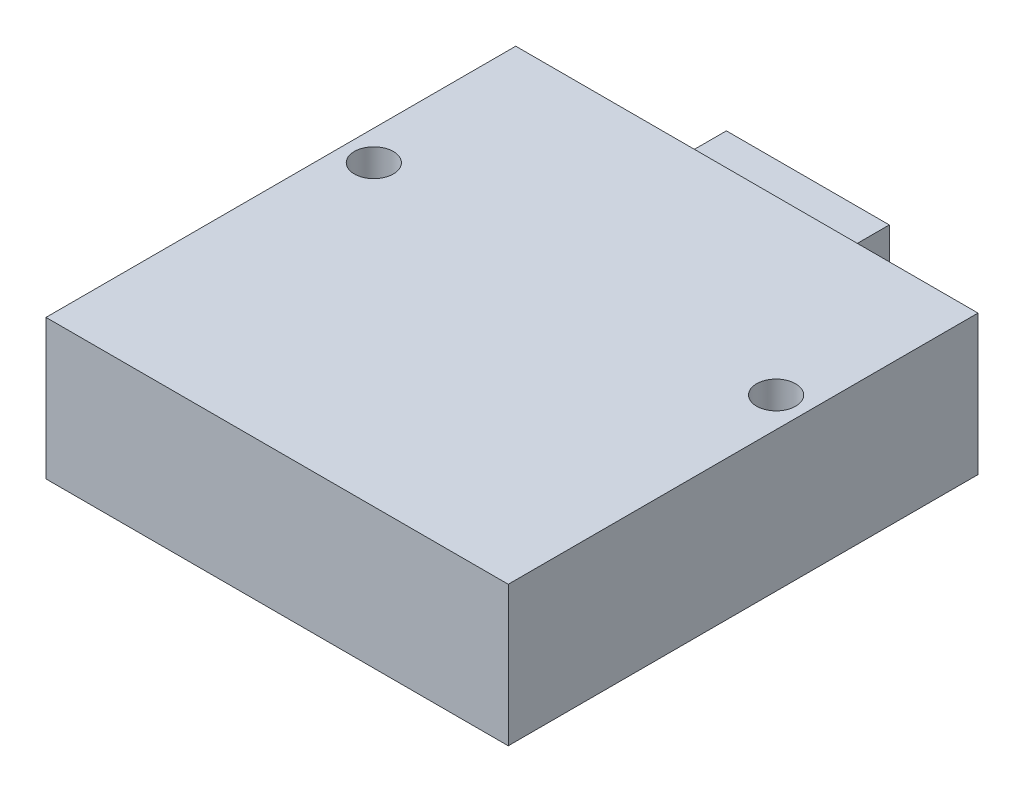
ISO-10303-21;
HEADER;
FILE_DESCRIPTION(('STEP AP214'),'2;1');
FILE_NAME('part.step','',(''),(''),'','','');
FILE_SCHEMA(('AUTOMOTIVE_DESIGN { 1 0 10303 214 1 1 1 1 }'));
ENDSEC;
DATA;
#1=APPLICATION_CONTEXT('core data for automotive mechanical design processes');
#2=APPLICATION_PROTOCOL_DEFINITION('international standard','automotive_design',2000,#1);
#3=PRODUCT_CONTEXT('',#1,'mechanical');
#4=PRODUCT('Part','Part','',(#3));
#5=PRODUCT_RELATED_PRODUCT_CATEGORY('part','',(#4));
#6=PRODUCT_DEFINITION_FORMATION('','',#4);
#7=PRODUCT_DEFINITION_CONTEXT('part definition',#1,'design');
#8=PRODUCT_DEFINITION('design','',#6,#7);
#9=PRODUCT_DEFINITION_SHAPE('','',#8);
#10=(LENGTH_UNIT() NAMED_UNIT(*) SI_UNIT(.MILLI.,.METRE.));
#11=(NAMED_UNIT(*) PLANE_ANGLE_UNIT() SI_UNIT($,.RADIAN.));
#12=(NAMED_UNIT(*) SI_UNIT($,.STERADIAN.) SOLID_ANGLE_UNIT());
#13=UNCERTAINTY_MEASURE_WITH_UNIT(LENGTH_MEASURE(1.E-05),#10,'distance_accuracy_value','');
#14=(GEOMETRIC_REPRESENTATION_CONTEXT(3) GLOBAL_UNCERTAINTY_ASSIGNED_CONTEXT((#13)) GLOBAL_UNIT_ASSIGNED_CONTEXT((#10,
#11,#12)) REPRESENTATION_CONTEXT('',''));
#15=CARTESIAN_POINT('',(0.,0.,0.));
#16=DIRECTION('',(0.,0.,1.));
#17=DIRECTION('',(1.,0.,0.));
#18=AXIS2_PLACEMENT_3D('',#15,#16,#17);
#19=CARTESIAN_POINT('',(58.7375,17.78,0.));
#20=DIRECTION('',(0.,0.,-1.));
#21=DIRECTION('',(-1.,0.,0.));
#22=AXIS2_PLACEMENT_3D('',#19,#20,#21);
#23=PLANE('',#22);
#24=DIRECTION('',(0.,1.,0.));
#25=VECTOR('',#24,1.);
#26=CARTESIAN_POINT('',(58.7375,-17.78,0.));
#27=LINE('',#26,#25);
#28=CARTESIAN_POINT('',(58.7375,-17.78,0.));
#29=VERTEX_POINT('',#28);
#30=CARTESIAN_POINT('',(58.7375,17.78,0.));
#31=VERTEX_POINT('',#30);
#32=EDGE_CURVE('E129',#29,#31,#27,.T.);
#33=ORIENTED_EDGE('',*,*,#32,.F.);
#34=DIRECTION('',(1.,0.,0.));
#35=VECTOR('',#34,1.);
#36=CARTESIAN_POINT('',(-58.7375,-17.78,0.));
#37=LINE('',#36,#35);
#38=CARTESIAN_POINT('',(-58.7375,-17.78,0.));
#39=VERTEX_POINT('',#38);
#40=EDGE_CURVE('E75',#39,#29,#37,.T.);
#41=ORIENTED_EDGE('',*,*,#40,.F.);
#42=DIRECTION('',(0.,-1.,0.));
#43=VECTOR('',#42,1.);
#44=CARTESIAN_POINT('',(-58.7375,-17.78,0.));
#45=LINE('',#44,#43);
#46=CARTESIAN_POINT('',(-58.7375,17.78,0.));
#47=VERTEX_POINT('',#46);
#48=EDGE_CURVE('E145',#47,#39,#45,.T.);
#49=ORIENTED_EDGE('',*,*,#48,.F.);
#50=DIRECTION('',(-1.,0.,0.));
#51=VECTOR('',#50,1.);
#52=CARTESIAN_POINT('',(-58.7375,17.78,0.));
#53=LINE('',#52,#51);
#54=EDGE_CURVE('E132',#31,#47,#53,.T.);
#55=ORIENTED_EDGE('',*,*,#54,.F.);
#56=EDGE_LOOP('',(#33,#41,#49,#55));
#57=FACE_BOUND('',#56,.T.);
#58=DIRECTION('',(1.,0.,0.));
#59=VECTOR('',#58,1.);
#60=CARTESIAN_POINT('',(20.701,10.414,0.));
#61=LINE('',#60,#59);
#62=CARTESIAN_POINT('',(-20.701,10.414,0.));
#63=VERTEX_POINT('',#62);
#64=CARTESIAN_POINT('',(20.701,10.414,0.));
#65=VERTEX_POINT('',#64);
#66=EDGE_CURVE('E225',#63,#65,#61,.T.);
#67=ORIENTED_EDGE('',*,*,#66,.F.);
#68=DIRECTION('',(0.,1.,0.));
#69=VECTOR('',#68,1.);
#70=CARTESIAN_POINT('',(-20.701,-10.414,0.));
#71=LINE('',#70,#69);
#72=CARTESIAN_POINT('',(-20.701,-10.414,0.));
#73=VERTEX_POINT('',#72);
#74=EDGE_CURVE('E127',#73,#63,#71,.T.);
#75=ORIENTED_EDGE('',*,*,#74,.F.);
#76=DIRECTION('',(-1.,0.,0.));
#77=VECTOR('',#76,1.);
#78=CARTESIAN_POINT('',(20.701,-10.414,0.));
#79=LINE('',#78,#77);
#80=CARTESIAN_POINT('',(20.701,-10.414,0.));
#81=VERTEX_POINT('',#80);
#82=EDGE_CURVE('E123',#81,#73,#79,.T.);
#83=ORIENTED_EDGE('',*,*,#82,.F.);
#84=DIRECTION('',(0.,-1.,0.));
#85=VECTOR('',#84,1.);
#86=CARTESIAN_POINT('',(20.701,-10.414,0.));
#87=LINE('',#86,#85);
#88=EDGE_CURVE('E227',#65,#81,#87,.T.);
#89=ORIENTED_EDGE('',*,*,#88,.F.);
#90=EDGE_LOOP('',(#67,#75,#83,#89));
#91=FACE_BOUND('',#90,.T.);
#92=ADVANCED_FACE('F30',(#57,#91),#23,.T.);
#93=CARTESIAN_POINT('',(58.7375,-17.78,119.38));
#94=DIRECTION('',(-1.,0.,0.));
#95=DIRECTION('',(0.,0.,1.));
#96=AXIS2_PLACEMENT_3D('',#93,#94,#95);
#97=PLANE('',#96);
#98=ORIENTED_EDGE('',*,*,#32,.T.);
#99=DIRECTION('',(0.,0.,-1.));
#100=VECTOR('',#99,1.);
#101=CARTESIAN_POINT('',(58.7375,17.78,119.38));
#102=LINE('',#101,#100);
#103=CARTESIAN_POINT('',(58.7375,17.78,119.38));
#104=VERTEX_POINT('',#103);
#105=EDGE_CURVE('E11',#104,#31,#102,.T.);
#106=ORIENTED_EDGE('',*,*,#105,.F.);
#107=DIRECTION('',(0.,1.,0.));
#108=VECTOR('',#107,1.);
#109=CARTESIAN_POINT('',(58.7375,-17.78,119.38));
#110=LINE('',#109,#108);
#111=CARTESIAN_POINT('',(58.7375,-17.78,119.38));
#112=VERTEX_POINT('',#111);
#113=EDGE_CURVE('E137',#112,#104,#110,.T.);
#114=ORIENTED_EDGE('',*,*,#113,.F.);
#115=DIRECTION('',(0.,0.,-1.));
#116=VECTOR('',#115,1.);
#117=CARTESIAN_POINT('',(58.7375,-17.78,119.38));
#118=LINE('',#117,#116);
#119=EDGE_CURVE('E142',#112,#29,#118,.T.);
#120=ORIENTED_EDGE('',*,*,#119,.T.);
#121=EDGE_LOOP('',(#98,#106,#114,#120));
#122=FACE_BOUND('',#121,.T.);
#123=ADVANCED_FACE('F32',(#122),#97,.F.);
#124=CARTESIAN_POINT('',(-58.7375,17.78,119.38));
#125=DIRECTION('',(0.,-1.,0.));
#126=DIRECTION('',(0.,0.,-1.));
#127=AXIS2_PLACEMENT_3D('',#124,#125,#126);
#128=PLANE('',#127);
#129=CARTESIAN_POINT('',(-51.1175,17.78,43.688));
#130=DIRECTION('',(0.,-1.,0.));
#131=DIRECTION('',(0.,0.,-1.));
#132=AXIS2_PLACEMENT_3D('',#129,#130,#131);
#133=CIRCLE('',#132,4.96100099999999);
#134=CARTESIAN_POINT('',(-51.1175,17.78,38.726999));
#135=VERTEX_POINT('',#134);
#136=EDGE_CURVE('E209',#135,#135,#133,.T.);
#137=ORIENTED_EDGE('',*,*,#136,.T.);
#138=EDGE_LOOP('',(#137));
#139=FACE_BOUND('',#138,.T.);
#140=CARTESIAN_POINT('',(51.1175,17.78,43.688));
#141=DIRECTION('',(0.,-1.,0.));
#142=DIRECTION('',(0.,0.,-1.));
#143=AXIS2_PLACEMENT_3D('',#140,#141,#142);
#144=CIRCLE('',#143,4.96100099999999);
#145=CARTESIAN_POINT('',(51.1175,17.78,38.726999));
#146=VERTEX_POINT('',#145);
#147=EDGE_CURVE('E218',#146,#146,#144,.T.);
#148=ORIENTED_EDGE('',*,*,#147,.T.);
#149=EDGE_LOOP('',(#148));
#150=FACE_BOUND('',#149,.T.);
#151=ORIENTED_EDGE('',*,*,#54,.T.);
#152=DIRECTION('',(0.,0.,-1.));
#153=VECTOR('',#152,1.);
#154=CARTESIAN_POINT('',(-58.7375,17.78,119.38));
#155=LINE('',#154,#153);
#156=CARTESIAN_POINT('',(-58.7375,17.78,119.38));
#157=VERTEX_POINT('',#156);
#158=EDGE_CURVE('E38',#157,#47,#155,.T.);
#159=ORIENTED_EDGE('',*,*,#158,.F.);
#160=DIRECTION('',(-1.,0.,0.));
#161=VECTOR('',#160,1.);
#162=CARTESIAN_POINT('',(-58.7375,17.78,119.38));
#163=LINE('',#162,#161);
#164=EDGE_CURVE('E82',#104,#157,#163,.T.);
#165=ORIENTED_EDGE('',*,*,#164,.F.);
#166=ORIENTED_EDGE('',*,*,#105,.T.);
#167=EDGE_LOOP('',(#151,#159,#165,#166));
#168=FACE_BOUND('',#167,.T.);
#169=ADVANCED_FACE('F174',(#139,#150,#168),#128,.F.);
#170=CARTESIAN_POINT('',(-58.7375,-17.78,119.38));
#171=DIRECTION('',(1.,0.,0.));
#172=DIRECTION('',(0.,0.,-1.));
#173=AXIS2_PLACEMENT_3D('',#170,#171,#172);
#174=PLANE('',#173);
#175=ORIENTED_EDGE('',*,*,#48,.T.);
#176=DIRECTION('',(0.,0.,-1.));
#177=VECTOR('',#176,1.);
#178=CARTESIAN_POINT('',(-58.7375,-17.78,119.38));
#179=LINE('',#178,#177);
#180=CARTESIAN_POINT('',(-58.7375,-17.78,119.38));
#181=VERTEX_POINT('',#180);
#182=EDGE_CURVE('E149',#181,#39,#179,.T.);
#183=ORIENTED_EDGE('',*,*,#182,.F.);
#184=DIRECTION('',(0.,-1.,0.));
#185=VECTOR('',#184,1.);
#186=CARTESIAN_POINT('',(-58.7375,-17.78,119.38));
#187=LINE('',#186,#185);
#188=EDGE_CURVE('E140',#157,#181,#187,.T.);
#189=ORIENTED_EDGE('',*,*,#188,.F.);
#190=ORIENTED_EDGE('',*,*,#158,.T.);
#191=EDGE_LOOP('',(#175,#183,#189,#190));
#192=FACE_BOUND('',#191,.T.);
#193=ADVANCED_FACE('F154',(#192),#174,.F.);
#194=CARTESIAN_POINT('',(-58.7375,-17.78,119.38));
#195=DIRECTION('',(0.,1.,0.));
#196=DIRECTION('',(0.,0.,1.));
#197=AXIS2_PLACEMENT_3D('',#194,#195,#196);
#198=PLANE('',#197);
#199=CARTESIAN_POINT('',(-51.1175,-17.78,43.688));
#200=DIRECTION('',(0.,-1.,0.));
#201=DIRECTION('',(0.,0.,-1.));
#202=AXIS2_PLACEMENT_3D('',#199,#200,#201);
#203=CIRCLE('',#202,4.96100099999999);
#204=CARTESIAN_POINT('',(-51.1175,-17.78,38.726999));
#205=VERTEX_POINT('',#204);
#206=EDGE_CURVE('E211',#205,#205,#203,.T.);
#207=ORIENTED_EDGE('',*,*,#206,.F.);
#208=EDGE_LOOP('',(#207));
#209=FACE_BOUND('',#208,.T.);
#210=CARTESIAN_POINT('',(51.1175,-17.78,43.688));
#211=DIRECTION('',(0.,-1.,0.));
#212=DIRECTION('',(0.,0.,-1.));
#213=AXIS2_PLACEMENT_3D('',#210,#211,#212);
#214=CIRCLE('',#213,4.96100099999999);
#215=CARTESIAN_POINT('',(51.1175,-17.78,38.726999));
#216=VERTEX_POINT('',#215);
#217=EDGE_CURVE('E213',#216,#216,#214,.T.);
#218=ORIENTED_EDGE('',*,*,#217,.F.);
#219=EDGE_LOOP('',(#218));
#220=FACE_BOUND('',#219,.T.);
#221=ORIENTED_EDGE('',*,*,#40,.T.);
#222=ORIENTED_EDGE('',*,*,#119,.F.);
#223=DIRECTION('',(1.,0.,0.));
#224=VECTOR('',#223,1.);
#225=CARTESIAN_POINT('',(-58.7375,-17.78,119.38));
#226=LINE('',#225,#224);
#227=EDGE_CURVE('E54',#181,#112,#226,.T.);
#228=ORIENTED_EDGE('',*,*,#227,.F.);
#229=ORIENTED_EDGE('',*,*,#182,.T.);
#230=EDGE_LOOP('',(#221,#222,#228,#229));
#231=FACE_BOUND('',#230,.T.);
#232=ADVANCED_FACE('F162',(#209,#220,#231),#198,.F.);
#233=CARTESIAN_POINT('',(58.7375,17.78,119.38));
#234=DIRECTION('',(0.,0.,-1.));
#235=DIRECTION('',(-1.,0.,0.));
#236=AXIS2_PLACEMENT_3D('',#233,#234,#235);
#237=PLANE('',#236);
#238=ORIENTED_EDGE('',*,*,#113,.T.);
#239=ORIENTED_EDGE('',*,*,#164,.T.);
#240=ORIENTED_EDGE('',*,*,#188,.T.);
#241=ORIENTED_EDGE('',*,*,#227,.T.);
#242=EDGE_LOOP('',(#238,#239,#240,#241));
#243=FACE_BOUND('',#242,.T.);
#244=ADVANCED_FACE('F164',(#243),#237,.F.);
#245=CARTESIAN_POINT('',(-20.701,-10.414,-15.494));
#246=DIRECTION('',(1.,0.,0.));
#247=DIRECTION('',(0.,0.,-1.));
#248=AXIS2_PLACEMENT_3D('',#245,#246,#247);
#249=PLANE('',#248);
#250=ORIENTED_EDGE('',*,*,#74,.T.);
#251=DIRECTION('',(0.,0.,1.));
#252=VECTOR('',#251,1.);
#253=CARTESIAN_POINT('',(-20.701,10.414,-15.494));
#254=LINE('',#253,#252);
#255=CARTESIAN_POINT('',(-20.701,10.414,-15.494));
#256=VERTEX_POINT('',#255);
#257=EDGE_CURVE('E108',#256,#63,#254,.T.);
#258=ORIENTED_EDGE('',*,*,#257,.F.);
#259=DIRECTION('',(0.,1.,0.));
#260=VECTOR('',#259,1.);
#261=CARTESIAN_POINT('',(-20.701,-10.414,-15.494));
#262=LINE('',#261,#260);
#263=CARTESIAN_POINT('',(-20.701,-10.414,-15.494));
#264=VERTEX_POINT('',#263);
#265=EDGE_CURVE('E115',#264,#256,#262,.T.);
#266=ORIENTED_EDGE('',*,*,#265,.F.);
#267=DIRECTION('',(0.,0.,1.));
#268=VECTOR('',#267,1.);
#269=CARTESIAN_POINT('',(-20.701,-10.414,-15.494));
#270=LINE('',#269,#268);
#271=EDGE_CURVE('E223',#264,#73,#270,.T.);
#272=ORIENTED_EDGE('',*,*,#271,.T.);
#273=EDGE_LOOP('',(#250,#258,#266,#272));
#274=FACE_BOUND('',#273,.T.);
#275=ADVANCED_FACE('F125',(#274),#249,.F.);
#276=CARTESIAN_POINT('',(20.701,10.414,-15.494));
#277=DIRECTION('',(0.,-1.,0.));
#278=DIRECTION('',(0.,0.,-1.));
#279=AXIS2_PLACEMENT_3D('',#276,#277,#278);
#280=PLANE('',#279);
#281=ORIENTED_EDGE('',*,*,#66,.T.);
#282=DIRECTION('',(0.,0.,1.));
#283=VECTOR('',#282,1.);
#284=CARTESIAN_POINT('',(20.701,10.414,-15.494));
#285=LINE('',#284,#283);
#286=CARTESIAN_POINT('',(20.701,10.414,-15.494));
#287=VERTEX_POINT('',#286);
#288=EDGE_CURVE('E111',#287,#65,#285,.T.);
#289=ORIENTED_EDGE('',*,*,#288,.F.);
#290=DIRECTION('',(1.,0.,0.));
#291=VECTOR('',#290,1.);
#292=CARTESIAN_POINT('',(20.701,10.414,-15.494));
#293=LINE('',#292,#291);
#294=EDGE_CURVE('E104',#256,#287,#293,.T.);
#295=ORIENTED_EDGE('',*,*,#294,.F.);
#296=ORIENTED_EDGE('',*,*,#257,.T.);
#297=EDGE_LOOP('',(#281,#289,#295,#296));
#298=FACE_BOUND('',#297,.T.);
#299=ADVANCED_FACE('F106',(#298),#280,.F.);
#300=CARTESIAN_POINT('',(20.701,-10.414,-15.494));
#301=DIRECTION('',(-1.,0.,0.));
#302=DIRECTION('',(0.,0.,1.));
#303=AXIS2_PLACEMENT_3D('',#300,#301,#302);
#304=PLANE('',#303);
#305=ORIENTED_EDGE('',*,*,#88,.T.);
#306=DIRECTION('',(0.,0.,1.));
#307=VECTOR('',#306,1.);
#308=CARTESIAN_POINT('',(20.701,-10.414,-15.494));
#309=LINE('',#308,#307);
#310=CARTESIAN_POINT('',(20.701,-10.414,-15.494));
#311=VERTEX_POINT('',#310);
#312=EDGE_CURVE('E45',#311,#81,#309,.T.);
#313=ORIENTED_EDGE('',*,*,#312,.F.);
#314=DIRECTION('',(0.,-1.,0.));
#315=VECTOR('',#314,1.);
#316=CARTESIAN_POINT('',(20.701,-10.414,-15.494));
#317=LINE('',#316,#315);
#318=EDGE_CURVE('E114',#287,#311,#317,.T.);
#319=ORIENTED_EDGE('',*,*,#318,.F.);
#320=ORIENTED_EDGE('',*,*,#288,.T.);
#321=EDGE_LOOP('',(#305,#313,#319,#320));
#322=FACE_BOUND('',#321,.T.);
#323=ADVANCED_FACE('F188',(#322),#304,.F.);
#324=CARTESIAN_POINT('',(20.701,-10.414,-15.494));
#325=DIRECTION('',(0.,1.,0.));
#326=DIRECTION('',(0.,0.,1.));
#327=AXIS2_PLACEMENT_3D('',#324,#325,#326);
#328=PLANE('',#327);
#329=ORIENTED_EDGE('',*,*,#82,.T.);
#330=ORIENTED_EDGE('',*,*,#271,.F.);
#331=DIRECTION('',(-1.,0.,0.));
#332=VECTOR('',#331,1.);
#333=CARTESIAN_POINT('',(20.701,-10.414,-15.494));
#334=LINE('',#333,#332);
#335=EDGE_CURVE('E119',#311,#264,#334,.T.);
#336=ORIENTED_EDGE('',*,*,#335,.F.);
#337=ORIENTED_EDGE('',*,*,#312,.T.);
#338=EDGE_LOOP('',(#329,#330,#336,#337));
#339=FACE_BOUND('',#338,.T.);
#340=ADVANCED_FACE('F191',(#339),#328,.F.);
#341=CARTESIAN_POINT('',(-20.701,10.414,-15.494));
#342=DIRECTION('',(0.,0.,1.));
#343=DIRECTION('',(1.,0.,0.));
#344=AXIS2_PLACEMENT_3D('',#341,#342,#343);
#345=PLANE('',#344);
#346=ORIENTED_EDGE('',*,*,#265,.T.);
#347=ORIENTED_EDGE('',*,*,#294,.T.);
#348=ORIENTED_EDGE('',*,*,#318,.T.);
#349=ORIENTED_EDGE('',*,*,#335,.T.);
#350=EDGE_LOOP('',(#346,#347,#348,#349));
#351=FACE_BOUND('',#350,.T.);
#352=ADVANCED_FACE('F118',(#351),#345,.F.);
#353=CARTESIAN_POINT('',(51.1175,-17.78,43.688));
#354=DIRECTION('',(0.,-1.,0.));
#355=DIRECTION('',(0.,0.,-1.));
#356=AXIS2_PLACEMENT_3D('',#353,#354,#355);
#357=CYLINDRICAL_SURFACE('',#356,4.96100099999999);
#358=ORIENTED_EDGE('',*,*,#147,.F.);
#359=EDGE_LOOP('',(#358));
#360=FACE_BOUND('',#359,.T.);
#361=ORIENTED_EDGE('',*,*,#217,.T.);
#362=EDGE_LOOP('',(#361));
#363=FACE_BOUND('',#362,.T.);
#364=ADVANCED_FACE('F197',(#360,#363),#357,.F.);
#365=CARTESIAN_POINT('',(-51.1175,-17.78,43.688));
#366=DIRECTION('',(0.,-1.,0.));
#367=DIRECTION('',(0.,0.,-1.));
#368=AXIS2_PLACEMENT_3D('',#365,#366,#367);
#369=CYLINDRICAL_SURFACE('',#368,4.96100099999999);
#370=ORIENTED_EDGE('',*,*,#136,.F.);
#371=EDGE_LOOP('',(#370));
#372=FACE_BOUND('',#371,.T.);
#373=ORIENTED_EDGE('',*,*,#206,.T.);
#374=EDGE_LOOP('',(#373));
#375=FACE_BOUND('',#374,.T.);
#376=ADVANCED_FACE('F200',(#372,#375),#369,.F.);
#377=CLOSED_SHELL('',(#92,#123,#169,#193,#232,#244,#275,#299,#323,#340,#352,#364,#376));
#378=MANIFOLD_SOLID_BREP('B2',#377);
#379=ADVANCED_BREP_SHAPE_REPRESENTATION('',(#18,#378),#14);
#380=SHAPE_DEFINITION_REPRESENTATION(#9,#379);
ENDSEC;
END-ISO-10303-21;
